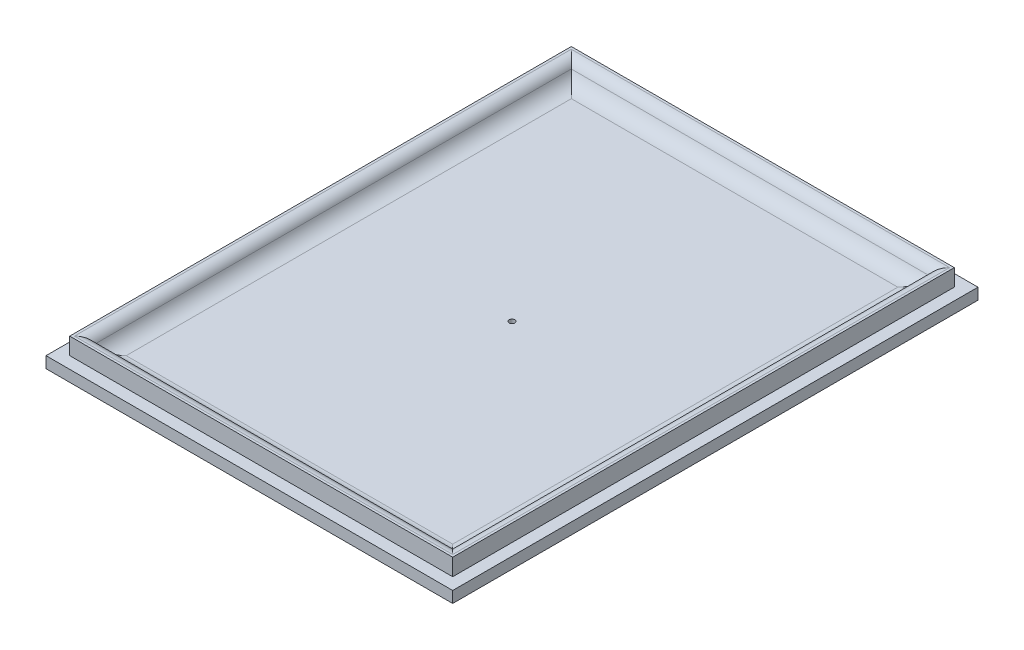
ISO-10303-21;
HEADER;
FILE_DESCRIPTION(('STEP AP214'),'2;1');
FILE_NAME('part.step','',(''),(''),'','','');
FILE_SCHEMA(('AUTOMOTIVE_DESIGN { 1 0 10303 214 1 1 1 1 }'));
ENDSEC;
DATA;
#1=APPLICATION_CONTEXT('core data for automotive mechanical design processes');
#2=APPLICATION_PROTOCOL_DEFINITION('international standard','automotive_design',2000,#1);
#3=PRODUCT_CONTEXT('',#1,'mechanical');
#4=PRODUCT('Part','Part','',(#3));
#5=PRODUCT_RELATED_PRODUCT_CATEGORY('part','',(#4));
#6=PRODUCT_DEFINITION_FORMATION('','',#4);
#7=PRODUCT_DEFINITION_CONTEXT('part definition',#1,'design');
#8=PRODUCT_DEFINITION('design','',#6,#7);
#9=PRODUCT_DEFINITION_SHAPE('','',#8);
#10=(LENGTH_UNIT() NAMED_UNIT(*) SI_UNIT(.MILLI.,.METRE.));
#11=(NAMED_UNIT(*) PLANE_ANGLE_UNIT() SI_UNIT($,.RADIAN.));
#12=(NAMED_UNIT(*) SI_UNIT($,.STERADIAN.) SOLID_ANGLE_UNIT());
#13=UNCERTAINTY_MEASURE_WITH_UNIT(LENGTH_MEASURE(1.E-05),#10,'distance_accuracy_value','');
#14=(GEOMETRIC_REPRESENTATION_CONTEXT(3) GLOBAL_UNCERTAINTY_ASSIGNED_CONTEXT((#13)) GLOBAL_UNIT_ASSIGNED_CONTEXT((#10,
#11,#12)) REPRESENTATION_CONTEXT('',''));
#15=CARTESIAN_POINT('',(0.,0.,0.));
#16=DIRECTION('',(0.,0.,1.));
#17=DIRECTION('',(1.,0.,0.));
#18=AXIS2_PLACEMENT_3D('',#15,#16,#17);
#19=CARTESIAN_POINT('',(0.,4.,0.));
#20=DIRECTION('',(0.,1.,0.));
#21=DIRECTION('',(0.,0.,1.));
#22=AXIS2_PLACEMENT_3D('',#19,#20,#21);
#23=PLANE('',#22);
#24=DIRECTION('',(1.,0.,0.));
#25=VECTOR('',#24,1.);
#26=CARTESIAN_POINT('',(0.,4.,4.2));
#27=LINE('',#26,#25);
#28=CARTESIAN_POINT('',(4.2,4.,4.2));
#29=VERTEX_POINT('',#28);
#30=CARTESIAN_POINT('',(139.8,4.,4.2));
#31=VERTEX_POINT('',#30);
#32=EDGE_CURVE('E145',#29,#31,#27,.T.);
#33=ORIENTED_EDGE('',*,*,#32,.T.);
#34=DIRECTION('',(0.,0.,1.));
#35=VECTOR('',#34,1.);
#36=CARTESIAN_POINT('',(139.8,4.,0.));
#37=LINE('',#36,#35);
#38=CARTESIAN_POINT('',(139.8,4.,181.8));
#39=VERTEX_POINT('',#38);
#40=EDGE_CURVE('E162',#31,#39,#37,.T.);
#41=ORIENTED_EDGE('',*,*,#40,.T.);
#42=DIRECTION('',(1.,0.,0.));
#43=VECTOR('',#42,1.);
#44=CARTESIAN_POINT('',(0.,4.,181.8));
#45=LINE('',#44,#43);
#46=CARTESIAN_POINT('',(4.2,4.,181.8));
#47=VERTEX_POINT('',#46);
#48=EDGE_CURVE('E164',#47,#39,#45,.T.);
#49=ORIENTED_EDGE('',*,*,#48,.F.);
#50=DIRECTION('',(0.,0.,1.));
#51=VECTOR('',#50,1.);
#52=CARTESIAN_POINT('',(4.2,4.,0.));
#53=LINE('',#52,#51);
#54=EDGE_CURVE('E173',#29,#47,#53,.T.);
#55=ORIENTED_EDGE('',*,*,#54,.F.);
#56=EDGE_LOOP('',(#33,#41,#49,#55));
#57=FACE_BOUND('',#56,.T.);
#58=DIRECTION('',(0.,0.,1.));
#59=VECTOR('',#58,1.);
#60=CARTESIAN_POINT('',(0.,4.,0.));
#61=LINE('',#60,#59);
#62=CARTESIAN_POINT('',(0.,4.,0.));
#63=VERTEX_POINT('',#62);
#64=CARTESIAN_POINT('',(0.,4.,186.));
#65=VERTEX_POINT('',#64);
#66=EDGE_CURVE('E183',#63,#65,#61,.T.);
#67=ORIENTED_EDGE('',*,*,#66,.T.);
#68=DIRECTION('',(1.,0.,0.));
#69=VECTOR('',#68,1.);
#70=CARTESIAN_POINT('',(0.,4.,186.));
#71=LINE('',#70,#69);
#72=CARTESIAN_POINT('',(144.,4.,186.));
#73=VERTEX_POINT('',#72);
#74=EDGE_CURVE('E186',#65,#73,#71,.T.);
#75=ORIENTED_EDGE('',*,*,#74,.T.);
#76=DIRECTION('',(0.,0.,-1.));
#77=VECTOR('',#76,1.);
#78=CARTESIAN_POINT('',(144.,4.,0.));
#79=LINE('',#78,#77);
#80=CARTESIAN_POINT('',(144.,4.,0.));
#81=VERTEX_POINT('',#80);
#82=EDGE_CURVE('E189',#73,#81,#79,.T.);
#83=ORIENTED_EDGE('',*,*,#82,.T.);
#84=DIRECTION('',(-1.,0.,0.));
#85=VECTOR('',#84,1.);
#86=CARTESIAN_POINT('',(0.,4.,0.));
#87=LINE('',#86,#85);
#88=EDGE_CURVE('E191',#81,#63,#87,.T.);
#89=ORIENTED_EDGE('',*,*,#88,.T.);
#90=EDGE_LOOP('',(#67,#75,#83,#89));
#91=FACE_BOUND('',#90,.T.);
#92=ADVANCED_FACE('F35',(#57,#91),#23,.T.);
#93=CARTESIAN_POINT('',(0.,4.,0.));
#94=DIRECTION('',(1.,0.,0.));
#95=DIRECTION('',(0.,0.,-1.));
#96=AXIS2_PLACEMENT_3D('',#93,#94,#95);
#97=PLANE('',#96);
#98=DIRECTION('',(0.,0.,1.));
#99=VECTOR('',#98,1.);
#100=CARTESIAN_POINT('',(0.,0.,0.));
#101=LINE('',#100,#99);
#102=CARTESIAN_POINT('',(0.,0.,0.));
#103=VERTEX_POINT('',#102);
#104=CARTESIAN_POINT('',(0.,0.,186.));
#105=VERTEX_POINT('',#104);
#106=EDGE_CURVE('E148',#103,#105,#101,.T.);
#107=ORIENTED_EDGE('',*,*,#106,.T.);
#108=DIRECTION('',(0.,-1.,0.));
#109=VECTOR('',#108,1.);
#110=CARTESIAN_POINT('',(0.,4.,186.));
#111=LINE('',#110,#109);
#112=EDGE_CURVE('E209',#65,#105,#111,.T.);
#113=ORIENTED_EDGE('',*,*,#112,.F.);
#114=ORIENTED_EDGE('',*,*,#66,.F.);
#115=DIRECTION('',(0.,-1.,0.));
#116=VECTOR('',#115,1.);
#117=CARTESIAN_POINT('',(0.,4.,0.));
#118=LINE('',#117,#116);
#119=EDGE_CURVE('E193',#63,#103,#118,.T.);
#120=ORIENTED_EDGE('',*,*,#119,.T.);
#121=EDGE_LOOP('',(#107,#113,#114,#120));
#122=FACE_BOUND('',#121,.T.);
#123=ADVANCED_FACE('F294',(#122),#97,.F.);
#124=CARTESIAN_POINT('',(0.,4.,186.));
#125=DIRECTION('',(0.,0.,-1.));
#126=DIRECTION('',(-1.,0.,0.));
#127=AXIS2_PLACEMENT_3D('',#124,#125,#126);
#128=PLANE('',#127);
#129=DIRECTION('',(1.,0.,0.));
#130=VECTOR('',#129,1.);
#131=CARTESIAN_POINT('',(0.,0.,186.));
#132=LINE('',#131,#130);
#133=CARTESIAN_POINT('',(144.,0.,186.));
#134=VERTEX_POINT('',#133);
#135=EDGE_CURVE('E196',#105,#134,#132,.T.);
#136=ORIENTED_EDGE('',*,*,#135,.T.);
#137=DIRECTION('',(0.,-1.,0.));
#138=VECTOR('',#137,1.);
#139=CARTESIAN_POINT('',(144.,4.,186.));
#140=LINE('',#139,#138);
#141=EDGE_CURVE('E206',#73,#134,#140,.T.);
#142=ORIENTED_EDGE('',*,*,#141,.F.);
#143=ORIENTED_EDGE('',*,*,#74,.F.);
#144=ORIENTED_EDGE('',*,*,#112,.T.);
#145=EDGE_LOOP('',(#136,#142,#143,#144));
#146=FACE_BOUND('',#145,.T.);
#147=ADVANCED_FACE('F299',(#146),#128,.F.);
#148=CARTESIAN_POINT('',(144.,4.,0.));
#149=DIRECTION('',(-1.,0.,0.));
#150=DIRECTION('',(0.,0.,1.));
#151=AXIS2_PLACEMENT_3D('',#148,#149,#150);
#152=PLANE('',#151);
#153=DIRECTION('',(0.,0.,-1.));
#154=VECTOR('',#153,1.);
#155=CARTESIAN_POINT('',(144.,0.,0.));
#156=LINE('',#155,#154);
#157=CARTESIAN_POINT('',(144.,0.,0.));
#158=VERTEX_POINT('',#157);
#159=EDGE_CURVE('E198',#134,#158,#156,.T.);
#160=ORIENTED_EDGE('',*,*,#159,.T.);
#161=DIRECTION('',(0.,-1.,0.));
#162=VECTOR('',#161,1.);
#163=CARTESIAN_POINT('',(144.,4.,0.));
#164=LINE('',#163,#162);
#165=EDGE_CURVE('E203',#81,#158,#164,.T.);
#166=ORIENTED_EDGE('',*,*,#165,.F.);
#167=ORIENTED_EDGE('',*,*,#82,.F.);
#168=ORIENTED_EDGE('',*,*,#141,.T.);
#169=EDGE_LOOP('',(#160,#166,#167,#168));
#170=FACE_BOUND('',#169,.T.);
#171=ADVANCED_FACE('F313',(#170),#152,.F.);
#172=CARTESIAN_POINT('',(0.,4.,0.));
#173=DIRECTION('',(0.,0.,1.));
#174=DIRECTION('',(1.,0.,0.));
#175=AXIS2_PLACEMENT_3D('',#172,#173,#174);
#176=PLANE('',#175);
#177=DIRECTION('',(-1.,0.,0.));
#178=VECTOR('',#177,1.);
#179=CARTESIAN_POINT('',(0.,0.,0.));
#180=LINE('',#179,#178);
#181=EDGE_CURVE('E187',#158,#103,#180,.T.);
#182=ORIENTED_EDGE('',*,*,#181,.T.);
#183=ORIENTED_EDGE('',*,*,#119,.F.);
#184=ORIENTED_EDGE('',*,*,#88,.F.);
#185=ORIENTED_EDGE('',*,*,#165,.T.);
#186=EDGE_LOOP('',(#182,#183,#184,#185));
#187=FACE_BOUND('',#186,.T.);
#188=ADVANCED_FACE('F309',(#187),#176,.F.);
#189=CARTESIAN_POINT('',(0.,0.,0.));
#190=DIRECTION('',(0.,1.,0.));
#191=DIRECTION('',(0.,0.,1.));
#192=AXIS2_PLACEMENT_3D('',#189,#190,#191);
#193=PLANE('',#192);
#194=CARTESIAN_POINT('',(72.,0.,93.));
#195=DIRECTION('',(0.,-1.,0.));
#196=DIRECTION('',(0.,0.,-1.));
#197=AXIS2_PLACEMENT_3D('',#194,#195,#196);
#198=CIRCLE('',#197,0.999999999999998);
#199=CARTESIAN_POINT('',(72.,0.,92.));
#200=VERTEX_POINT('',#199);
#201=EDGE_CURVE('E167',#200,#200,#198,.T.);
#202=ORIENTED_EDGE('',*,*,#201,.F.);
#203=EDGE_LOOP('',(#202));
#204=FACE_BOUND('',#203,.T.);
#205=ORIENTED_EDGE('',*,*,#106,.F.);
#206=ORIENTED_EDGE('',*,*,#181,.F.);
#207=ORIENTED_EDGE('',*,*,#159,.F.);
#208=ORIENTED_EDGE('',*,*,#135,.F.);
#209=EDGE_LOOP('',(#205,#206,#207,#208));
#210=FACE_BOUND('',#209,.T.);
#211=ADVANCED_FACE('F306',(#204,#210),#193,.F.);
#212=CARTESIAN_POINT('',(0.,10.,4.2));
#213=DIRECTION('',(0.,0.,-1.));
#214=DIRECTION('',(-1.,0.,0.));
#215=AXIS2_PLACEMENT_3D('',#212,#213,#214);
#216=PLANE('',#215);
#217=ORIENTED_EDGE('',*,*,#32,.F.);
#218=DIRECTION('',(0.,-1.,0.));
#219=VECTOR('',#218,1.);
#220=CARTESIAN_POINT('',(4.2,10.,4.2));
#221=LINE('',#220,#219);
#222=CARTESIAN_POINT('',(4.2,10.,4.2));
#223=VERTEX_POINT('',#222);
#224=EDGE_CURVE('E138',#223,#29,#221,.T.);
#225=ORIENTED_EDGE('',*,*,#224,.F.);
#226=DIRECTION('',(1.,0.,0.));
#227=VECTOR('',#226,1.);
#228=CARTESIAN_POINT('',(0.,10.,4.2));
#229=LINE('',#228,#227);
#230=CARTESIAN_POINT('',(139.8,10.,4.2));
#231=VERTEX_POINT('',#230);
#232=EDGE_CURVE('E143',#223,#231,#229,.T.);
#233=ORIENTED_EDGE('',*,*,#232,.T.);
#234=DIRECTION('',(0.,-1.,0.));
#235=VECTOR('',#234,1.);
#236=CARTESIAN_POINT('',(139.8,10.,4.2));
#237=LINE('',#236,#235);
#238=EDGE_CURVE('E171',#231,#31,#237,.T.);
#239=ORIENTED_EDGE('',*,*,#238,.T.);
#240=EDGE_LOOP('',(#217,#225,#233,#239));
#241=FACE_BOUND('',#240,.T.);
#242=ADVANCED_FACE('F140',(#241),#216,.T.);
#243=CARTESIAN_POINT('',(4.2,10.,0.));
#244=DIRECTION('',(1.,0.,0.));
#245=DIRECTION('',(0.,0.,-1.));
#246=AXIS2_PLACEMENT_3D('',#243,#244,#245);
#247=PLANE('',#246);
#248=ORIENTED_EDGE('',*,*,#54,.T.);
#249=DIRECTION('',(0.,-1.,0.));
#250=VECTOR('',#249,1.);
#251=CARTESIAN_POINT('',(4.2,10.,181.8));
#252=LINE('',#251,#250);
#253=CARTESIAN_POINT('',(4.2,10.,181.8));
#254=VERTEX_POINT('',#253);
#255=EDGE_CURVE('E149',#254,#47,#252,.T.);
#256=ORIENTED_EDGE('',*,*,#255,.F.);
#257=DIRECTION('',(0.,0.,1.));
#258=VECTOR('',#257,1.);
#259=CARTESIAN_POINT('',(4.2,10.,0.));
#260=LINE('',#259,#258);
#261=EDGE_CURVE('E152',#223,#254,#260,.T.);
#262=ORIENTED_EDGE('',*,*,#261,.F.);
#263=ORIENTED_EDGE('',*,*,#224,.T.);
#264=EDGE_LOOP('',(#248,#256,#262,#263));
#265=FACE_BOUND('',#264,.T.);
#266=ADVANCED_FACE('F153',(#265),#247,.F.);
#267=CARTESIAN_POINT('',(0.,10.,181.8));
#268=DIRECTION('',(0.,0.,-1.));
#269=DIRECTION('',(-1.,0.,0.));
#270=AXIS2_PLACEMENT_3D('',#267,#268,#269);
#271=PLANE('',#270);
#272=ORIENTED_EDGE('',*,*,#48,.T.);
#273=DIRECTION('',(0.,-1.,0.));
#274=VECTOR('',#273,1.);
#275=CARTESIAN_POINT('',(139.8,10.,181.8));
#276=LINE('',#275,#274);
#277=CARTESIAN_POINT('',(139.8,10.,181.8));
#278=VERTEX_POINT('',#277);
#279=EDGE_CURVE('E179',#278,#39,#276,.T.);
#280=ORIENTED_EDGE('',*,*,#279,.F.);
#281=DIRECTION('',(1.,0.,0.));
#282=VECTOR('',#281,1.);
#283=CARTESIAN_POINT('',(0.,10.,181.8));
#284=LINE('',#283,#282);
#285=EDGE_CURVE('E157',#254,#278,#284,.T.);
#286=ORIENTED_EDGE('',*,*,#285,.F.);
#287=ORIENTED_EDGE('',*,*,#255,.T.);
#288=EDGE_LOOP('',(#272,#280,#286,#287));
#289=FACE_BOUND('',#288,.T.);
#290=ADVANCED_FACE('F289',(#289),#271,.F.);
#291=CARTESIAN_POINT('',(139.8,10.,0.));
#292=DIRECTION('',(1.,0.,0.));
#293=DIRECTION('',(0.,0.,-1.));
#294=AXIS2_PLACEMENT_3D('',#291,#292,#293);
#295=PLANE('',#294);
#296=ORIENTED_EDGE('',*,*,#40,.F.);
#297=ORIENTED_EDGE('',*,*,#238,.F.);
#298=DIRECTION('',(0.,0.,1.));
#299=VECTOR('',#298,1.);
#300=CARTESIAN_POINT('',(139.8,10.,0.));
#301=LINE('',#300,#299);
#302=EDGE_CURVE('E161',#231,#278,#301,.T.);
#303=ORIENTED_EDGE('',*,*,#302,.T.);
#304=ORIENTED_EDGE('',*,*,#279,.T.);
#305=EDGE_LOOP('',(#296,#297,#303,#304));
#306=FACE_BOUND('',#305,.T.);
#307=ADVANCED_FACE('F280',(#306),#295,.T.);
#308=CARTESIAN_POINT('',(0.,10.,0.));
#309=DIRECTION('',(0.,1.,0.));
#310=DIRECTION('',(0.,0.,1.));
#311=AXIS2_PLACEMENT_3D('',#308,#309,#310);
#312=PLANE('',#311);
#313=DIRECTION('',(0.,0.,1.));
#314=VECTOR('',#313,1.);
#315=CARTESIAN_POINT('',(5.03484861008832,10.,8.2));
#316=LINE('',#315,#314);
#317=CARTESIAN_POINT('',(5.03484861008834,10.,180.965151389912));
#318=VERTEX_POINT('',#317);
#319=CARTESIAN_POINT('',(5.03484861008832,10.,5.03484861008832));
#320=VERTEX_POINT('',#319);
#321=EDGE_CURVE('E222',#318,#320,#316,.F.);
#322=ORIENTED_EDGE('',*,*,#321,.T.);
#323=DIRECTION('',(-1.,0.,0.));
#324=VECTOR('',#323,1.);
#325=CARTESIAN_POINT('',(135.8,10.,5.03484861008832));
#326=LINE('',#325,#324);
#327=CARTESIAN_POINT('',(138.965151389912,10.,5.03484861008832));
#328=VERTEX_POINT('',#327);
#329=EDGE_CURVE('E236',#320,#328,#326,.F.);
#330=ORIENTED_EDGE('',*,*,#329,.T.);
#331=DIRECTION('',(0.,0.,-1.));
#332=VECTOR('',#331,1.);
#333=CARTESIAN_POINT('',(138.965151389912,10.,177.8));
#334=LINE('',#333,#332);
#335=CARTESIAN_POINT('',(138.965151389912,10.,180.965151389912));
#336=VERTEX_POINT('',#335);
#337=EDGE_CURVE('E234',#328,#336,#334,.F.);
#338=ORIENTED_EDGE('',*,*,#337,.T.);
#339=DIRECTION('',(1.,0.,0.));
#340=VECTOR('',#339,1.);
#341=CARTESIAN_POINT('',(8.20000000000002,10.,180.965151389912));
#342=LINE('',#341,#340);
#343=EDGE_CURVE('E232',#336,#318,#342,.F.);
#344=ORIENTED_EDGE('',*,*,#343,.T.);
#345=EDGE_LOOP('',(#322,#330,#338,#344));
#346=FACE_BOUND('',#345,.T.);
#347=ORIENTED_EDGE('',*,*,#232,.F.);
#348=ORIENTED_EDGE('',*,*,#261,.T.);
#349=ORIENTED_EDGE('',*,*,#285,.T.);
#350=ORIENTED_EDGE('',*,*,#302,.F.);
#351=EDGE_LOOP('',(#347,#348,#349,#350));
#352=FACE_BOUND('',#351,.T.);
#353=ADVANCED_FACE('F159',(#346,#352),#312,.T.);
#354=CARTESIAN_POINT('',(72.,4.,93.));
#355=DIRECTION('',(0.,1.,0.));
#356=DIRECTION('',(0.,0.,1.));
#357=AXIS2_PLACEMENT_3D('',#354,#355,#356);
#358=CIRCLE('',#357,0.999999999999998);
#359=CARTESIAN_POINT('',(72.,4.,94.));
#360=VERTEX_POINT('',#359);
#361=EDGE_CURVE('E39',#360,#360,#358,.T.);
#362=ORIENTED_EDGE('',*,*,#361,.F.);
#363=EDGE_LOOP('',(#362));
#364=FACE_BOUND('',#363,.T.);
#365=DIRECTION('',(0.,0.,1.));
#366=VECTOR('',#365,1.);
#367=CARTESIAN_POINT('',(14.2,4.,177.8));
#368=LINE('',#367,#366);
#369=CARTESIAN_POINT('',(14.2,4.,14.2));
#370=VERTEX_POINT('',#369);
#371=CARTESIAN_POINT('',(14.2,4.,171.8));
#372=VERTEX_POINT('',#371);
#373=EDGE_CURVE('E212',#370,#372,#368,.T.);
#374=ORIENTED_EDGE('',*,*,#373,.T.);
#375=DIRECTION('',(1.,0.,0.));
#376=VECTOR('',#375,1.);
#377=CARTESIAN_POINT('',(135.8,4.,171.8));
#378=LINE('',#377,#376);
#379=CARTESIAN_POINT('',(129.8,4.,171.8));
#380=VERTEX_POINT('',#379);
#381=EDGE_CURVE('E219',#372,#380,#378,.T.);
#382=ORIENTED_EDGE('',*,*,#381,.T.);
#383=DIRECTION('',(0.,0.,1.));
#384=VECTOR('',#383,1.);
#385=CARTESIAN_POINT('',(129.8,4.,0.));
#386=LINE('',#385,#384);
#387=CARTESIAN_POINT('',(129.8,4.,14.2));
#388=VERTEX_POINT('',#387);
#389=EDGE_CURVE('E216',#380,#388,#386,.F.);
#390=ORIENTED_EDGE('',*,*,#389,.T.);
#391=DIRECTION('',(1.,0.,0.));
#392=VECTOR('',#391,1.);
#393=CARTESIAN_POINT('',(0.,4.,14.2));
#394=LINE('',#393,#392);
#395=EDGE_CURVE('E214',#388,#370,#394,.F.);
#396=ORIENTED_EDGE('',*,*,#395,.T.);
#397=EDGE_LOOP('',(#374,#382,#390,#396));
#398=FACE_BOUND('',#397,.T.);
#399=ADVANCED_FACE('F279',(#364,#398),#23,.T.);
#400=CARTESIAN_POINT('',(0.,10.,14.2));
#401=DIRECTION('',(1.,0.,0.));
#402=DIRECTION('',(0.,0.,-1.));
#403=AXIS2_PLACEMENT_3D('',#400,#401,#402);
#404=CYLINDRICAL_SURFACE('',#403,6.);
#405=CARTESIAN_POINT('',(129.8,10.,14.2));
#406=DIRECTION('',(0.707106781186548,0.,0.707106781186547));
#407=DIRECTION('',(-0.707106781186547,0.,0.707106781186548));
#408=AXIS2_PLACEMENT_3D('',#405,#406,#407);
#409=ELLIPSE('',#408,8.48528137423857,6.);
#410=CARTESIAN_POINT('',(135.299090833947,7.6,8.70090916605299));
#411=VERTEX_POINT('',#410);
#412=EDGE_CURVE('E228',#411,#388,#409,.F.);
#413=ORIENTED_EDGE('',*,*,#412,.F.);
#414=DIRECTION('',(1.,0.,0.));
#415=VECTOR('',#414,1.);
#416=CARTESIAN_POINT('',(0.,7.6,8.70090916605299));
#417=LINE('',#416,#415);
#418=CARTESIAN_POINT('',(8.70090916605299,7.6,8.70090916605299));
#419=VERTEX_POINT('',#418);
#420=EDGE_CURVE('E239',#411,#419,#417,.F.);
#421=ORIENTED_EDGE('',*,*,#420,.T.);
#422=CARTESIAN_POINT('',(14.2,10.,14.2));
#423=DIRECTION('',(0.707106781186547,0.,-0.707106781186548));
#424=DIRECTION('',(0.707106781186548,0.,0.707106781186547));
#425=AXIS2_PLACEMENT_3D('',#422,#423,#424);
#426=ELLIPSE('',#425,8.48528137423857,6.);
#427=EDGE_CURVE('E174',#370,#419,#426,.T.);
#428=ORIENTED_EDGE('',*,*,#427,.F.);
#429=ORIENTED_EDGE('',*,*,#395,.F.);
#430=EDGE_LOOP('',(#413,#421,#428,#429));
#431=FACE_BOUND('',#430,.T.);
#432=ADVANCED_FACE('F272',(#431),#404,.F.);
#433=CARTESIAN_POINT('',(14.2,10.,0.));
#434=DIRECTION('',(0.,0.,-1.));
#435=DIRECTION('',(-1.,0.,0.));
#436=AXIS2_PLACEMENT_3D('',#433,#434,#435);
#437=CYLINDRICAL_SURFACE('',#436,6.);
#438=ORIENTED_EDGE('',*,*,#427,.T.);
#439=DIRECTION('',(0.,0.,-1.));
#440=VECTOR('',#439,1.);
#441=CARTESIAN_POINT('',(8.70090916605299,7.6,0.));
#442=LINE('',#441,#440);
#443=CARTESIAN_POINT('',(8.70090916605301,7.6,177.299090833947));
#444=VERTEX_POINT('',#443);
#445=EDGE_CURVE('E11',#419,#444,#442,.F.);
#446=ORIENTED_EDGE('',*,*,#445,.T.);
#447=CARTESIAN_POINT('',(14.2,10.,171.8));
#448=DIRECTION('',(-0.707106781186548,0.,-0.707106781186547));
#449=DIRECTION('',(-0.707106781186547,0.,0.707106781186548));
#450=AXIS2_PLACEMENT_3D('',#447,#448,#449);
#451=ELLIPSE('',#450,8.48528137423857,6.);
#452=EDGE_CURVE('E225',#372,#444,#451,.T.);
#453=ORIENTED_EDGE('',*,*,#452,.F.);
#454=ORIENTED_EDGE('',*,*,#373,.F.);
#455=EDGE_LOOP('',(#438,#446,#453,#454));
#456=FACE_BOUND('',#455,.T.);
#457=ADVANCED_FACE('F326',(#456),#437,.F.);
#458=CARTESIAN_POINT('',(129.8,10.,0.));
#459=DIRECTION('',(0.,0.,1.));
#460=DIRECTION('',(1.,0.,0.));
#461=AXIS2_PLACEMENT_3D('',#458,#459,#460);
#462=CYLINDRICAL_SURFACE('',#461,6.);
#463=CARTESIAN_POINT('',(129.8,10.,171.8));
#464=DIRECTION('',(-0.707106781186547,0.,0.707106781186548));
#465=DIRECTION('',(-0.707106781186548,0.,-0.707106781186547));
#466=AXIS2_PLACEMENT_3D('',#463,#464,#465);
#467=ELLIPSE('',#466,8.48528137423857,6.);
#468=CARTESIAN_POINT('',(135.299090833947,7.6,177.299090833947));
#469=VERTEX_POINT('',#468);
#470=EDGE_CURVE('E223',#469,#380,#467,.F.);
#471=ORIENTED_EDGE('',*,*,#470,.F.);
#472=DIRECTION('',(0.,0.,1.));
#473=VECTOR('',#472,1.);
#474=CARTESIAN_POINT('',(135.299090833947,7.6,0.));
#475=LINE('',#474,#473);
#476=EDGE_CURVE('E242',#469,#411,#475,.F.);
#477=ORIENTED_EDGE('',*,*,#476,.T.);
#478=ORIENTED_EDGE('',*,*,#412,.T.);
#479=ORIENTED_EDGE('',*,*,#389,.F.);
#480=EDGE_LOOP('',(#471,#477,#478,#479));
#481=FACE_BOUND('',#480,.T.);
#482=ADVANCED_FACE('F267',(#481),#462,.F.);
#483=CARTESIAN_POINT('',(0.,10.,171.8));
#484=DIRECTION('',(-1.,0.,0.));
#485=DIRECTION('',(0.,0.,1.));
#486=AXIS2_PLACEMENT_3D('',#483,#484,#485);
#487=CYLINDRICAL_SURFACE('',#486,6.);
#488=ORIENTED_EDGE('',*,*,#452,.T.);
#489=DIRECTION('',(-1.,0.,0.));
#490=VECTOR('',#489,1.);
#491=CARTESIAN_POINT('',(0.,7.6,177.299090833947));
#492=LINE('',#491,#490);
#493=EDGE_CURVE('E44',#444,#469,#492,.F.);
#494=ORIENTED_EDGE('',*,*,#493,.T.);
#495=ORIENTED_EDGE('',*,*,#470,.T.);
#496=ORIENTED_EDGE('',*,*,#381,.F.);
#497=EDGE_LOOP('',(#488,#494,#495,#496));
#498=FACE_BOUND('',#497,.T.);
#499=ADVANCED_FACE('F321',(#498),#487,.F.);
#500=CARTESIAN_POINT('',(0.,6.,180.965151389912));
#501=DIRECTION('',(-1.,0.,0.));
#502=DIRECTION('',(0.,0.,1.));
#503=AXIS2_PLACEMENT_3D('',#500,#501,#502);
#504=CYLINDRICAL_SURFACE('',#503,4.);
#505=CARTESIAN_POINT('',(138.965151389912,6.,180.965151389912));
#506=DIRECTION('',(-0.707106781186547,0.,0.707106781186548));
#507=DIRECTION('',(0.707106781186548,0.,0.707106781186547));
#508=AXIS2_PLACEMENT_3D('',#505,#506,#507);
#509=ELLIPSE('',#508,5.65685424949238,4.);
#510=EDGE_CURVE('E249',#469,#336,#509,.F.);
#511=ORIENTED_EDGE('',*,*,#510,.F.);
#512=ORIENTED_EDGE('',*,*,#493,.F.);
#513=CARTESIAN_POINT('',(5.03484861008834,6.,180.965151389912));
#514=DIRECTION('',(-0.707106781186548,0.,-0.707106781186547));
#515=DIRECTION('',(-0.707106781186547,0.,0.707106781186548));
#516=AXIS2_PLACEMENT_3D('',#513,#514,#515);
#517=ELLIPSE('',#516,5.65685424949238,4.);
#518=EDGE_CURVE('E226',#318,#444,#517,.T.);
#519=ORIENTED_EDGE('',*,*,#518,.F.);
#520=ORIENTED_EDGE('',*,*,#343,.F.);
#521=EDGE_LOOP('',(#511,#512,#519,#520));
#522=FACE_BOUND('',#521,.T.);
#523=ADVANCED_FACE('F37',(#522),#504,.T.);
#524=CARTESIAN_POINT('',(5.03484861008832,6.,0.));
#525=DIRECTION('',(0.,0.,-1.));
#526=DIRECTION('',(-1.,0.,0.));
#527=AXIS2_PLACEMENT_3D('',#524,#525,#526);
#528=CYLINDRICAL_SURFACE('',#527,4.);
#529=ORIENTED_EDGE('',*,*,#518,.T.);
#530=ORIENTED_EDGE('',*,*,#445,.F.);
#531=CARTESIAN_POINT('',(5.03484861008832,6.,5.03484861008832));
#532=DIRECTION('',(0.707106781186547,0.,-0.707106781186548));
#533=DIRECTION('',(0.707106781186548,0.,0.707106781186547));
#534=AXIS2_PLACEMENT_3D('',#531,#532,#533);
#535=ELLIPSE('',#534,5.65685424949238,4.);
#536=EDGE_CURVE('E247',#320,#419,#535,.T.);
#537=ORIENTED_EDGE('',*,*,#536,.F.);
#538=ORIENTED_EDGE('',*,*,#321,.F.);
#539=EDGE_LOOP('',(#529,#530,#537,#538));
#540=FACE_BOUND('',#539,.T.);
#541=ADVANCED_FACE('F255',(#540),#528,.T.);
#542=CARTESIAN_POINT('',(138.965151389912,6.,0.));
#543=DIRECTION('',(0.,0.,1.));
#544=DIRECTION('',(1.,0.,0.));
#545=AXIS2_PLACEMENT_3D('',#542,#543,#544);
#546=CYLINDRICAL_SURFACE('',#545,4.);
#547=ORIENTED_EDGE('',*,*,#510,.T.);
#548=ORIENTED_EDGE('',*,*,#337,.F.);
#549=CARTESIAN_POINT('',(138.965151389912,6.,5.03484861008832));
#550=DIRECTION('',(0.707106781186548,0.,0.707106781186547));
#551=DIRECTION('',(0.707106781186547,0.,-0.707106781186548));
#552=AXIS2_PLACEMENT_3D('',#549,#550,#551);
#553=ELLIPSE('',#552,5.65685424949238,4.);
#554=EDGE_CURVE('E245',#411,#328,#553,.F.);
#555=ORIENTED_EDGE('',*,*,#554,.F.);
#556=ORIENTED_EDGE('',*,*,#476,.F.);
#557=EDGE_LOOP('',(#547,#548,#555,#556));
#558=FACE_BOUND('',#557,.T.);
#559=ADVANCED_FACE('F264',(#558),#546,.T.);
#560=CARTESIAN_POINT('',(0.,6.,5.03484861008832));
#561=DIRECTION('',(1.,0.,0.));
#562=DIRECTION('',(0.,0.,-1.));
#563=AXIS2_PLACEMENT_3D('',#560,#561,#562);
#564=CYLINDRICAL_SURFACE('',#563,4.);
#565=ORIENTED_EDGE('',*,*,#536,.T.);
#566=ORIENTED_EDGE('',*,*,#420,.F.);
#567=ORIENTED_EDGE('',*,*,#554,.T.);
#568=ORIENTED_EDGE('',*,*,#329,.F.);
#569=EDGE_LOOP('',(#565,#566,#567,#568));
#570=FACE_BOUND('',#569,.T.);
#571=ADVANCED_FACE('F275',(#570),#564,.T.);
#572=CARTESIAN_POINT('',(72.,6.,93.));
#573=DIRECTION('',(0.,-1.,0.));
#574=DIRECTION('',(0.,0.,-1.));
#575=AXIS2_PLACEMENT_3D('',#572,#573,#574);
#576=CYLINDRICAL_SURFACE('',#575,0.999999999999998);
#577=ORIENTED_EDGE('',*,*,#361,.T.);
#578=EDGE_LOOP('',(#577));
#579=FACE_BOUND('',#578,.T.);
#580=ORIENTED_EDGE('',*,*,#201,.T.);
#581=EDGE_LOOP('',(#580));
#582=FACE_BOUND('',#581,.T.);
#583=ADVANCED_FACE('F333',(#579,#582),#576,.F.);
#584=CLOSED_SHELL('',(#92,#123,#147,#171,#188,#211,#242,#266,#290,#307,#353,#399,#432,#457,#482,
#499,#523,#541,#559,#571,#583));
#585=MANIFOLD_SOLID_BREP('B2',#584);
#586=ADVANCED_BREP_SHAPE_REPRESENTATION('',(#18,#585),#14);
#587=SHAPE_DEFINITION_REPRESENTATION(#9,#586);
ENDSEC;
END-ISO-10303-21;
